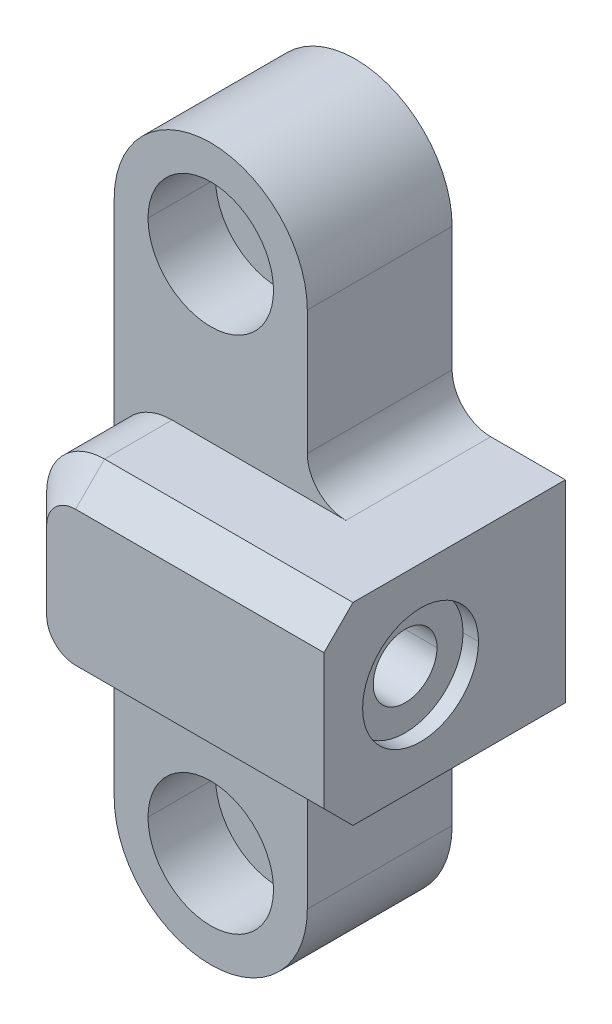
ISO-10303-21;
HEADER;
FILE_DESCRIPTION(('STEP AP214'),'2;1');
FILE_NAME('part.step','',(''),(''),'','','');
FILE_SCHEMA(('AUTOMOTIVE_DESIGN { 1 0 10303 214 1 1 1 1 }'));
ENDSEC;
DATA;
#1=APPLICATION_CONTEXT('core data for automotive mechanical design processes');
#2=APPLICATION_PROTOCOL_DEFINITION('international standard','automotive_design',2000,#1);
#3=PRODUCT_CONTEXT('',#1,'mechanical');
#4=PRODUCT('Part','Part','',(#3));
#5=PRODUCT_RELATED_PRODUCT_CATEGORY('part','',(#4));
#6=PRODUCT_DEFINITION_FORMATION('','',#4);
#7=PRODUCT_DEFINITION_CONTEXT('part definition',#1,'design');
#8=PRODUCT_DEFINITION('design','',#6,#7);
#9=PRODUCT_DEFINITION_SHAPE('','',#8);
#10=(LENGTH_UNIT() NAMED_UNIT(*) SI_UNIT(.MILLI.,.METRE.));
#11=(NAMED_UNIT(*) PLANE_ANGLE_UNIT() SI_UNIT($,.RADIAN.));
#12=(NAMED_UNIT(*) SI_UNIT($,.STERADIAN.) SOLID_ANGLE_UNIT());
#13=UNCERTAINTY_MEASURE_WITH_UNIT(LENGTH_MEASURE(1.E-05),#10,'distance_accuracy_value','');
#14=(GEOMETRIC_REPRESENTATION_CONTEXT(3) GLOBAL_UNCERTAINTY_ASSIGNED_CONTEXT((#13)) GLOBAL_UNIT_ASSIGNED_CONTEXT((#10,
#11,#12)) REPRESENTATION_CONTEXT('',''));
#15=CARTESIAN_POINT('',(0.,0.,0.));
#16=DIRECTION('',(0.,0.,1.));
#17=DIRECTION('',(1.,0.,0.));
#18=AXIS2_PLACEMENT_3D('',#15,#16,#17);
#19=CARTESIAN_POINT('',(-2.74531104495465,-3.5,12.5));
#20=DIRECTION('',(0.,-0.707106781186547,0.707106781186548));
#21=DIRECTION('',(-1.,0.,0.));
#22=AXIS2_PLACEMENT_3D('',#19,#20,#21);
#23=PLANE('',#22);
#24=DIRECTION('',(0.,-0.707106781186548,-0.707106781186547));
#25=VECTOR('',#24,1.);
#26=CARTESIAN_POINT('',(11.4350288425443,-3.5,12.5));
#27=LINE('',#26,#25);
#28=CARTESIAN_POINT('',(11.4350288425443,-3.5,12.5));
#29=VERTEX_POINT('',#28);
#30=CARTESIAN_POINT('',(11.4350288425443,-5.,11.));
#31=VERTEX_POINT('',#30);
#32=EDGE_CURVE('E9',#29,#31,#27,.T.);
#33=ORIENTED_EDGE('',*,*,#32,.T.);
#34=DIRECTION('',(-1.,0.,0.));
#35=VECTOR('',#34,1.);
#36=CARTESIAN_POINT('',(11.4350288425443,-5.,11.));
#37=LINE('',#36,#35);
#38=CARTESIAN_POINT('',(24.300000000001,-5.,11.));
#39=VERTEX_POINT('',#38);
#40=EDGE_CURVE('E492',#39,#31,#37,.T.);
#41=ORIENTED_EDGE('',*,*,#40,.F.);
#42=DIRECTION('',(0.,-0.707106781186548,-0.707106781186547));
#43=VECTOR('',#42,1.);
#44=CARTESIAN_POINT('',(24.300000000001,-3.5,12.5));
#45=LINE('',#44,#43);
#46=CARTESIAN_POINT('',(24.300000000001,-3.5,12.5));
#47=VERTEX_POINT('',#46);
#48=EDGE_CURVE('E453',#47,#39,#45,.T.);
#49=ORIENTED_EDGE('',*,*,#48,.F.);
#50=DIRECTION('',(1.,0.,0.));
#51=VECTOR('',#50,1.);
#52=CARTESIAN_POINT('',(24.300000000001,-3.5,12.5));
#53=LINE('',#52,#51);
#54=EDGE_CURVE('E483',#29,#47,#53,.T.);
#55=ORIENTED_EDGE('',*,*,#54,.F.);
#56=EDGE_LOOP('',(#33,#41,#49,#55));
#57=FACE_BOUND('',#56,.T.);
#58=ADVANCED_FACE('F15',(#57),#23,.T.);
#59=CARTESIAN_POINT('',(11.4350288425443,-2.,12.5));
#60=DIRECTION('',(0.,0.,-1.));
#61=DIRECTION('',(-1.,0.,0.));
#62=AXIS2_PLACEMENT_3D('',#59,#60,#61);
#63=CONICAL_SURFACE('',#62,1.5,0.785398163397449);
#64=DIRECTION('',(-0.707106781186549,0.,-0.707106781186546));
#65=VECTOR('',#64,1.);
#66=CARTESIAN_POINT('',(9.9350288425443,-2.,12.5));
#67=LINE('',#66,#65);
#68=CARTESIAN_POINT('',(9.9350288425443,-2.,12.5));
#69=VERTEX_POINT('',#68);
#70=CARTESIAN_POINT('',(8.4350288425443,-2.,11.));
#71=VERTEX_POINT('',#70);
#72=EDGE_CURVE('E23',#69,#71,#67,.T.);
#73=ORIENTED_EDGE('',*,*,#72,.T.);
#74=CARTESIAN_POINT('',(11.4350288425443,-2.,11.));
#75=DIRECTION('',(0.,0.,-1.));
#76=DIRECTION('',(1.,0.,0.));
#77=AXIS2_PLACEMENT_3D('',#74,#75,#76);
#78=CIRCLE('',#77,3.);
#79=EDGE_CURVE('E286',#31,#71,#78,.T.);
#80=ORIENTED_EDGE('',*,*,#79,.F.);
#81=ORIENTED_EDGE('',*,*,#32,.F.);
#82=CARTESIAN_POINT('',(11.4350288425443,-2.,12.5));
#83=DIRECTION('',(0.,0.,1.));
#84=DIRECTION('',(0.,-1.,0.));
#85=AXIS2_PLACEMENT_3D('',#82,#83,#84);
#86=CIRCLE('',#85,1.5);
#87=EDGE_CURVE('E587',#69,#29,#86,.T.);
#88=ORIENTED_EDGE('',*,*,#87,.F.);
#89=EDGE_LOOP('',(#73,#80,#81,#88));
#90=FACE_BOUND('',#89,.T.);
#91=ADVANCED_FACE('F618',(#90),#63,.T.);
#92=CARTESIAN_POINT('',(8.4350288425443,13.4350288425445,11.));
#93=DIRECTION('',(-0.707106781186547,0.,0.707106781186549));
#94=DIRECTION('',(0.,1.,0.));
#95=AXIS2_PLACEMENT_3D('',#92,#93,#94);
#96=PLANE('',#95);
#97=DIRECTION('',(-0.707106781186548,0.,-0.707106781186547));
#98=VECTOR('',#97,1.);
#99=CARTESIAN_POINT('',(9.9350288425443,2.,12.5));
#100=LINE('',#99,#98);
#101=CARTESIAN_POINT('',(9.9350288425443,2.,12.5));
#102=VERTEX_POINT('',#101);
#103=CARTESIAN_POINT('',(8.4350288425443,2.,11.));
#104=VERTEX_POINT('',#103);
#105=EDGE_CURVE('E36',#102,#104,#100,.T.);
#106=ORIENTED_EDGE('',*,*,#105,.T.);
#107=DIRECTION('',(0.,1.,0.));
#108=VECTOR('',#107,1.);
#109=CARTESIAN_POINT('',(8.4350288425443,2.,11.));
#110=LINE('',#109,#108);
#111=EDGE_CURVE('E474',#71,#104,#110,.T.);
#112=ORIENTED_EDGE('',*,*,#111,.F.);
#113=ORIENTED_EDGE('',*,*,#72,.F.);
#114=DIRECTION('',(0.,-1.,0.));
#115=VECTOR('',#114,1.);
#116=CARTESIAN_POINT('',(9.9350288425443,-2.,12.5));
#117=LINE('',#116,#115);
#118=EDGE_CURVE('E347',#102,#69,#117,.T.);
#119=ORIENTED_EDGE('',*,*,#118,.F.);
#120=EDGE_LOOP('',(#106,#112,#113,#119));
#121=FACE_BOUND('',#120,.T.);
#122=ADVANCED_FACE('F626',(#121),#96,.T.);
#123=CARTESIAN_POINT('',(11.4350288425443,2.,12.5));
#124=DIRECTION('',(0.,0.,-1.));
#125=DIRECTION('',(-1.,0.,0.));
#126=AXIS2_PLACEMENT_3D('',#123,#124,#125);
#127=CONICAL_SURFACE('',#126,1.5,0.785398163397449);
#128=DIRECTION('',(0.,0.707106781186549,-0.707106781186547));
#129=VECTOR('',#128,1.);
#130=CARTESIAN_POINT('',(11.4350288425443,3.5,12.5));
#131=LINE('',#130,#129);
#132=CARTESIAN_POINT('',(11.4350288425443,3.5,12.5));
#133=VERTEX_POINT('',#132);
#134=CARTESIAN_POINT('',(11.4350288425443,5.,11.));
#135=VERTEX_POINT('',#134);
#136=EDGE_CURVE('E47',#133,#135,#131,.T.);
#137=ORIENTED_EDGE('',*,*,#136,.T.);
#138=CARTESIAN_POINT('',(11.4350288425443,2.,11.));
#139=DIRECTION('',(0.,0.,-1.));
#140=DIRECTION('',(1.,0.,0.));
#141=AXIS2_PLACEMENT_3D('',#138,#139,#140);
#142=CIRCLE('',#141,3.);
#143=EDGE_CURVE('E570',#104,#135,#142,.T.);
#144=ORIENTED_EDGE('',*,*,#143,.F.);
#145=ORIENTED_EDGE('',*,*,#105,.F.);
#146=CARTESIAN_POINT('',(11.4350288425443,2.,12.5));
#147=DIRECTION('',(0.,0.,1.));
#148=DIRECTION('',(0.,-1.,0.));
#149=AXIS2_PLACEMENT_3D('',#146,#147,#148);
#150=CIRCLE('',#149,1.5);
#151=EDGE_CURVE('E352',#133,#102,#150,.T.);
#152=ORIENTED_EDGE('',*,*,#151,.F.);
#153=EDGE_LOOP('',(#137,#144,#145,#152));
#154=FACE_BOUND('',#153,.T.);
#155=ADVANCED_FACE('F645',(#154),#127,.T.);
#156=CARTESIAN_POINT('',(24.300000000001,5.,11.));
#157=DIRECTION('',(0.,0.707106781186547,0.707106781186548));
#158=DIRECTION('',(1.,0.,0.));
#159=AXIS2_PLACEMENT_3D('',#156,#157,#158);
#160=PLANE('',#159);
#161=DIRECTION('',(0.,-0.707106781186549,0.707106781186547));
#162=VECTOR('',#161,1.);
#163=CARTESIAN_POINT('',(24.300000000001,5.,11.));
#164=LINE('',#163,#162);
#165=CARTESIAN_POINT('',(24.300000000001,5.,11.));
#166=VERTEX_POINT('',#165);
#167=CARTESIAN_POINT('',(24.300000000001,3.5,12.5));
#168=VERTEX_POINT('',#167);
#169=EDGE_CURVE('E452',#166,#168,#164,.T.);
#170=ORIENTED_EDGE('',*,*,#169,.F.);
#171=DIRECTION('',(1.,0.,0.));
#172=VECTOR('',#171,1.);
#173=CARTESIAN_POINT('',(24.300000000001,5.,11.));
#174=LINE('',#173,#172);
#175=EDGE_CURVE('E433',#135,#166,#174,.T.);
#176=ORIENTED_EDGE('',*,*,#175,.F.);
#177=ORIENTED_EDGE('',*,*,#136,.F.);
#178=DIRECTION('',(-1.,0.,0.));
#179=VECTOR('',#178,1.);
#180=CARTESIAN_POINT('',(11.4350288425443,3.5,12.5));
#181=LINE('',#180,#179);
#182=EDGE_CURVE('E479',#168,#133,#181,.T.);
#183=ORIENTED_EDGE('',*,*,#182,.F.);
#184=EDGE_LOOP('',(#170,#176,#177,#183));
#185=FACE_BOUND('',#184,.T.);
#186=ADVANCED_FACE('F652',(#185),#160,.T.);
#187=CARTESIAN_POINT('',(11.4350288425443,2.,7.5));
#188=DIRECTION('',(0.,0.,-1.));
#189=DIRECTION('',(-1.,0.,0.));
#190=AXIS2_PLACEMENT_3D('',#187,#188,#189);
#191=CYLINDRICAL_SURFACE('',#190,3.);
#192=DIRECTION('',(0.,0.,-1.));
#193=VECTOR('',#192,1.);
#194=CARTESIAN_POINT('',(8.4350288425443,2.,7.5));
#195=LINE('',#194,#193);
#196=CARTESIAN_POINT('',(8.4350288425443,2.,7.5));
#197=VERTEX_POINT('',#196);
#198=EDGE_CURVE('E523',#104,#197,#195,.T.);
#199=ORIENTED_EDGE('',*,*,#198,.F.);
#200=ORIENTED_EDGE('',*,*,#143,.T.);
#201=DIRECTION('',(0.,0.,1.));
#202=VECTOR('',#201,1.);
#203=CARTESIAN_POINT('',(11.4350288425443,5.,7.5));
#204=LINE('',#203,#202);
#205=CARTESIAN_POINT('',(11.4350288425443,5.,7.5));
#206=VERTEX_POINT('',#205);
#207=EDGE_CURVE('E579',#206,#135,#204,.T.);
#208=ORIENTED_EDGE('',*,*,#207,.F.);
#209=CARTESIAN_POINT('',(11.4350288425443,2.,7.5));
#210=DIRECTION('',(0.,0.,-1.));
#211=DIRECTION('',(1.,0.,0.));
#212=AXIS2_PLACEMENT_3D('',#209,#210,#211);
#213=CIRCLE('',#212,3.);
#214=EDGE_CURVE('E413',#197,#206,#213,.T.);
#215=ORIENTED_EDGE('',*,*,#214,.F.);
#216=EDGE_LOOP('',(#199,#200,#208,#215));
#217=FACE_BOUND('',#216,.T.);
#218=ADVANCED_FACE('F648',(#217),#191,.T.);
#219=CARTESIAN_POINT('',(11.4350288425443,-2.,7.5));
#220=DIRECTION('',(0.,0.,1.));
#221=DIRECTION('',(1.,0.,0.));
#222=AXIS2_PLACEMENT_3D('',#219,#220,#221);
#223=CYLINDRICAL_SURFACE('',#222,3.);
#224=DIRECTION('',(0.,0.,-1.));
#225=VECTOR('',#224,1.);
#226=CARTESIAN_POINT('',(11.4350288425443,-5.,7.5));
#227=LINE('',#226,#225);
#228=CARTESIAN_POINT('',(11.4350288425443,-5.,7.5));
#229=VERTEX_POINT('',#228);
#230=EDGE_CURVE('E496',#31,#229,#227,.T.);
#231=ORIENTED_EDGE('',*,*,#230,.F.);
#232=ORIENTED_EDGE('',*,*,#79,.T.);
#233=DIRECTION('',(0.,0.,1.));
#234=VECTOR('',#233,1.);
#235=CARTESIAN_POINT('',(8.4350288425443,-2.,7.5));
#236=LINE('',#235,#234);
#237=CARTESIAN_POINT('',(8.4350288425443,-2.,7.5));
#238=VERTEX_POINT('',#237);
#239=EDGE_CURVE('E470',#238,#71,#236,.T.);
#240=ORIENTED_EDGE('',*,*,#239,.F.);
#241=CARTESIAN_POINT('',(11.4350288425443,-2.,7.5));
#242=DIRECTION('',(0.,0.,-1.));
#243=DIRECTION('',(1.,0.,0.));
#244=AXIS2_PLACEMENT_3D('',#241,#242,#243);
#245=CIRCLE('',#244,3.);
#246=EDGE_CURVE('E327',#229,#238,#245,.T.);
#247=ORIENTED_EDGE('',*,*,#246,.F.);
#248=EDGE_LOOP('',(#231,#232,#240,#247));
#249=FACE_BOUND('',#248,.T.);
#250=ADVANCED_FACE('F623',(#249),#223,.T.);
#251=CARTESIAN_POINT('',(23.500000000001,0.,7.5));
#252=DIRECTION('',(1.,0.,0.));
#253=DIRECTION('',(0.,0.,-1.));
#254=AXIS2_PLACEMENT_3D('',#251,#252,#253);
#255=CYLINDRICAL_SURFACE('',#254,1.65);
#256=DIRECTION('',(1.,0.,0.));
#257=VECTOR('',#256,1.);
#258=CARTESIAN_POINT('',(23.500000000001,0.,9.15));
#259=LINE('',#258,#257);
#260=CARTESIAN_POINT('',(14.500000000001,0.,9.15));
#261=VERTEX_POINT('',#260);
#262=CARTESIAN_POINT('',(23.500000000001,0.,9.15));
#263=VERTEX_POINT('',#262);
#264=EDGE_CURVE('E298',#261,#263,#259,.T.);
#265=ORIENTED_EDGE('',*,*,#264,.F.);
#266=CARTESIAN_POINT('',(14.500000000001,0.,7.5));
#267=DIRECTION('',(1.,0.,0.));
#268=DIRECTION('',(0.,0.,-1.));
#269=AXIS2_PLACEMENT_3D('',#266,#267,#268);
#270=CIRCLE('',#269,1.65);
#271=CARTESIAN_POINT('',(14.500000000001,0.,5.85));
#272=VERTEX_POINT('',#271);
#273=EDGE_CURVE('E275',#272,#261,#270,.T.);
#274=ORIENTED_EDGE('',*,*,#273,.F.);
#275=DIRECTION('',(1.,0.,0.));
#276=VECTOR('',#275,1.);
#277=CARTESIAN_POINT('',(23.500000000001,0.,5.85));
#278=LINE('',#277,#276);
#279=CARTESIAN_POINT('',(23.500000000001,0.,5.85));
#280=VERTEX_POINT('',#279);
#281=EDGE_CURVE('E307',#272,#280,#278,.T.);
#282=ORIENTED_EDGE('',*,*,#281,.T.);
#283=CARTESIAN_POINT('',(23.500000000001,0.,7.5));
#284=DIRECTION('',(1.,0.,0.));
#285=DIRECTION('',(0.,0.,-1.));
#286=AXIS2_PLACEMENT_3D('',#283,#284,#285);
#287=CIRCLE('',#286,1.65);
#288=EDGE_CURVE('E287',#280,#263,#287,.T.);
#289=ORIENTED_EDGE('',*,*,#288,.T.);
#290=EDGE_LOOP('',(#265,#274,#282,#289));
#291=FACE_BOUND('',#290,.T.);
#292=ADVANCED_FACE('F299',(#291),#255,.F.);
#293=CARTESIAN_POINT('',(14.500000000001,0.,7.5));
#294=DIRECTION('',(1.,0.,0.));
#295=DIRECTION('',(0.,0.,-1.));
#296=AXIS2_PLACEMENT_3D('',#293,#294,#295);
#297=CONICAL_SURFACE('',#296,1.65,1.02974425867665);
#298=DIRECTION('',(0.515038074910056,0.,0.857167300702112));
#299=VECTOR('',#298,1.);
#300=CARTESIAN_POINT('',(14.500000000001,0.,9.15));
#301=LINE('',#300,#299);
#302=CARTESIAN_POINT('',(13.5085799786055,0.,7.5));
#303=VERTEX_POINT('',#302);
#304=EDGE_CURVE('E278',#303,#261,#301,.T.);
#305=ORIENTED_EDGE('',*,*,#304,.F.);
#306=DIRECTION('',(0.515038074910056,0.,-0.857167300702112));
#307=VECTOR('',#306,1.);
#308=CARTESIAN_POINT('',(14.500000000001,0.,5.85));
#309=LINE('',#308,#307);
#310=EDGE_CURVE('E280',#303,#272,#309,.T.);
#311=ORIENTED_EDGE('',*,*,#310,.T.);
#312=ORIENTED_EDGE('',*,*,#273,.T.);
#313=EDGE_LOOP('',(#305,#311,#312));
#314=FACE_BOUND('',#313,.T.);
#315=ADVANCED_FACE('F277',(#314),#297,.F.);
#316=CARTESIAN_POINT('',(23.500000000001,0.,7.5));
#317=DIRECTION('',(1.,0.,0.));
#318=DIRECTION('',(0.,1.,0.));
#319=AXIS2_PLACEMENT_3D('',#316,#317,#318);
#320=PLANE('',#319);
#321=ORIENTED_EDGE('',*,*,#288,.F.);
#322=CARTESIAN_POINT('',(23.500000000001,0.,7.5));
#323=DIRECTION('',(1.,0.,0.));
#324=DIRECTION('',(0.,0.,-1.));
#325=AXIS2_PLACEMENT_3D('',#322,#323,#324);
#326=CIRCLE('',#325,1.65);
#327=EDGE_CURVE('E304',#263,#280,#326,.T.);
#328=ORIENTED_EDGE('',*,*,#327,.F.);
#329=EDGE_LOOP('',(#321,#328));
#330=FACE_BOUND('',#329,.T.);
#331=CARTESIAN_POINT('',(23.500000000001,0.,7.5));
#332=DIRECTION('',(1.,0.,0.));
#333=DIRECTION('',(0.,0.,-1.));
#334=AXIS2_PLACEMENT_3D('',#331,#332,#333);
#335=CIRCLE('',#334,3.);
#336=CARTESIAN_POINT('',(23.500000000001,0.,4.5));
#337=VERTEX_POINT('',#336);
#338=CARTESIAN_POINT('',(23.500000000001,0.,10.5));
#339=VERTEX_POINT('',#338);
#340=EDGE_CURVE('E351',#337,#339,#335,.T.);
#341=ORIENTED_EDGE('',*,*,#340,.T.);
#342=CARTESIAN_POINT('',(23.500000000001,0.,7.5));
#343=DIRECTION('',(1.,0.,0.));
#344=DIRECTION('',(0.,0.,-1.));
#345=AXIS2_PLACEMENT_3D('',#342,#343,#344);
#346=CIRCLE('',#345,3.);
#347=EDGE_CURVE('E295',#339,#337,#346,.T.);
#348=ORIENTED_EDGE('',*,*,#347,.T.);
#349=EDGE_LOOP('',(#341,#348));
#350=FACE_BOUND('',#349,.T.);
#351=ADVANCED_FACE('F727',(#330,#350),#320,.T.);
#352=CARTESIAN_POINT('',(23.500000000001,0.,7.5));
#353=DIRECTION('',(1.,0.,0.));
#354=DIRECTION('',(0.,0.,-1.));
#355=AXIS2_PLACEMENT_3D('',#352,#353,#354);
#356=CYLINDRICAL_SURFACE('',#355,3.);
#357=DIRECTION('',(1.,0.,0.));
#358=VECTOR('',#357,1.);
#359=CARTESIAN_POINT('',(23.500000000001,0.,10.5));
#360=LINE('',#359,#358);
#361=CARTESIAN_POINT('',(24.300000000001,0.,10.5));
#362=VERTEX_POINT('',#361);
#363=EDGE_CURVE('E313',#339,#362,#360,.T.);
#364=ORIENTED_EDGE('',*,*,#363,.F.);
#365=ORIENTED_EDGE('',*,*,#340,.F.);
#366=DIRECTION('',(1.,0.,0.));
#367=VECTOR('',#366,1.);
#368=CARTESIAN_POINT('',(23.500000000001,0.,4.5));
#369=LINE('',#368,#367);
#370=CARTESIAN_POINT('',(24.300000000001,0.,4.5));
#371=VERTEX_POINT('',#370);
#372=EDGE_CURVE('E321',#337,#371,#369,.T.);
#373=ORIENTED_EDGE('',*,*,#372,.T.);
#374=CARTESIAN_POINT('',(24.300000000001,0.,7.5));
#375=DIRECTION('',(1.,0.,0.));
#376=DIRECTION('',(0.,0.,-1.));
#377=AXIS2_PLACEMENT_3D('',#374,#375,#376);
#378=CIRCLE('',#377,3.);
#379=EDGE_CURVE('E576',#371,#362,#378,.T.);
#380=ORIENTED_EDGE('',*,*,#379,.T.);
#381=EDGE_LOOP('',(#364,#365,#373,#380));
#382=FACE_BOUND('',#381,.T.);
#383=ADVANCED_FACE('F730',(#382),#356,.F.);
#384=CARTESIAN_POINT('',(-2.74531104495465,-5.,12.5));
#385=DIRECTION('',(0.,0.,1.));
#386=DIRECTION('',(0.,-1.,0.));
#387=AXIS2_PLACEMENT_3D('',#384,#385,#386);
#388=PLANE('',#387);
#389=ORIENTED_EDGE('',*,*,#87,.T.);
#390=ORIENTED_EDGE('',*,*,#54,.T.);
#391=DIRECTION('',(0.,-1.,0.));
#392=VECTOR('',#391,1.);
#393=CARTESIAN_POINT('',(24.300000000001,-5.,12.5));
#394=LINE('',#393,#392);
#395=EDGE_CURVE('E532',#168,#47,#394,.T.);
#396=ORIENTED_EDGE('',*,*,#395,.F.);
#397=ORIENTED_EDGE('',*,*,#182,.T.);
#398=ORIENTED_EDGE('',*,*,#151,.T.);
#399=ORIENTED_EDGE('',*,*,#118,.T.);
#400=EDGE_LOOP('',(#389,#390,#396,#397,#398,#399));
#401=FACE_BOUND('',#400,.T.);
#402=ADVANCED_FACE('F644',(#401),#388,.T.);
#403=CARTESIAN_POINT('',(13.4350288425443,13.4350288425445,4.));
#404=DIRECTION('',(0.,0.,1.));
#405=DIRECTION('',(1.,0.,0.));
#406=AXIS2_PLACEMENT_3D('',#403,#404,#405);
#407=PLANE('',#406);
#408=CARTESIAN_POINT('',(13.4350288425443,13.4350288425445,4.));
#409=DIRECTION('',(0.,0.,1.));
#410=DIRECTION('',(1.,0.,0.));
#411=AXIS2_PLACEMENT_3D('',#408,#409,#410);
#412=CIRCLE('',#411,1.7);
#413=CARTESIAN_POINT('',(11.7350288425443,13.4350288425445,4.));
#414=VERTEX_POINT('',#413);
#415=CARTESIAN_POINT('',(15.1350288425443,13.4350288425445,4.));
#416=VERTEX_POINT('',#415);
#417=EDGE_CURVE('E430',#414,#416,#412,.T.);
#418=ORIENTED_EDGE('',*,*,#417,.F.);
#419=CARTESIAN_POINT('',(13.4350288425443,13.4350288425445,4.));
#420=DIRECTION('',(0.,0.,1.));
#421=DIRECTION('',(1.,0.,0.));
#422=AXIS2_PLACEMENT_3D('',#419,#420,#421);
#423=CIRCLE('',#422,1.7);
#424=EDGE_CURVE('E438',#416,#414,#423,.T.);
#425=ORIENTED_EDGE('',*,*,#424,.F.);
#426=EDGE_LOOP('',(#418,#425));
#427=FACE_BOUND('',#426,.T.);
#428=CARTESIAN_POINT('',(13.4350288425443,13.4350288425445,4.));
#429=DIRECTION('',(0.,0.,1.));
#430=DIRECTION('',(1.,0.,0.));
#431=AXIS2_PLACEMENT_3D('',#428,#429,#430);
#432=CIRCLE('',#431,3.25);
#433=CARTESIAN_POINT('',(16.6850288425443,13.4350288425445,4.));
#434=VERTEX_POINT('',#433);
#435=CARTESIAN_POINT('',(10.1850288425443,13.4350288425445,4.));
#436=VERTEX_POINT('',#435);
#437=EDGE_CURVE('E390',#434,#436,#432,.T.);
#438=ORIENTED_EDGE('',*,*,#437,.T.);
#439=CARTESIAN_POINT('',(13.4350288425443,13.4350288425445,4.));
#440=DIRECTION('',(0.,0.,1.));
#441=DIRECTION('',(1.,0.,0.));
#442=AXIS2_PLACEMENT_3D('',#439,#440,#441);
#443=CIRCLE('',#442,3.25);
#444=EDGE_CURVE('E371',#436,#434,#443,.T.);
#445=ORIENTED_EDGE('',*,*,#444,.T.);
#446=EDGE_LOOP('',(#438,#445));
#447=FACE_BOUND('',#446,.T.);
#448=ADVANCED_FACE('F1086',(#427,#447),#407,.T.);
#449=CARTESIAN_POINT('',(13.4350288425443,13.4350288425445,4.));
#450=DIRECTION('',(0.,0.,1.));
#451=DIRECTION('',(1.,0.,0.));
#452=AXIS2_PLACEMENT_3D('',#449,#450,#451);
#453=CYLINDRICAL_SURFACE('',#452,3.25);
#454=DIRECTION('',(0.,0.,1.));
#455=VECTOR('',#454,1.);
#456=CARTESIAN_POINT('',(10.1850288425443,13.4350288425445,4.));
#457=LINE('',#456,#455);
#458=CARTESIAN_POINT('',(10.1850288425443,13.4350288425445,7.5));
#459=VERTEX_POINT('',#458);
#460=EDGE_CURVE('E366',#436,#459,#457,.T.);
#461=ORIENTED_EDGE('',*,*,#460,.F.);
#462=ORIENTED_EDGE('',*,*,#437,.F.);
#463=DIRECTION('',(0.,0.,1.));
#464=VECTOR('',#463,1.);
#465=CARTESIAN_POINT('',(16.6850288425443,13.4350288425445,4.));
#466=LINE('',#465,#464);
#467=CARTESIAN_POINT('',(16.6850288425443,13.4350288425445,7.5));
#468=VERTEX_POINT('',#467);
#469=EDGE_CURVE('E386',#434,#468,#466,.T.);
#470=ORIENTED_EDGE('',*,*,#469,.T.);
#471=CARTESIAN_POINT('',(13.4350288425443,13.4350288425445,7.5));
#472=DIRECTION('',(0.,0.,1.));
#473=DIRECTION('',(1.,0.,0.));
#474=AXIS2_PLACEMENT_3D('',#471,#472,#473);
#475=CIRCLE('',#474,3.25);
#476=EDGE_CURVE('E442',#468,#459,#475,.T.);
#477=ORIENTED_EDGE('',*,*,#476,.T.);
#478=EDGE_LOOP('',(#461,#462,#470,#477));
#479=FACE_BOUND('',#478,.T.);
#480=ADVANCED_FACE('F1096',(#479),#453,.F.);
#481=CARTESIAN_POINT('',(13.4350288425445,-13.4350288425443,4.));
#482=DIRECTION('',(0.,0.,1.));
#483=DIRECTION('',(1.,0.,0.));
#484=AXIS2_PLACEMENT_3D('',#481,#482,#483);
#485=PLANE('',#484);
#486=CARTESIAN_POINT('',(13.4350288425445,-13.4350288425443,4.));
#487=DIRECTION('',(0.,0.,1.));
#488=DIRECTION('',(1.,0.,0.));
#489=AXIS2_PLACEMENT_3D('',#486,#487,#488);
#490=CIRCLE('',#489,1.7);
#491=CARTESIAN_POINT('',(11.7350288425445,-13.4350288425443,4.));
#492=VERTEX_POINT('',#491);
#493=CARTESIAN_POINT('',(15.1350288425445,-13.4350288425443,4.));
#494=VERTEX_POINT('',#493);
#495=EDGE_CURVE('E399',#492,#494,#490,.T.);
#496=ORIENTED_EDGE('',*,*,#495,.F.);
#497=CARTESIAN_POINT('',(13.4350288425445,-13.4350288425443,4.));
#498=DIRECTION('',(0.,0.,1.));
#499=DIRECTION('',(1.,0.,0.));
#500=AXIS2_PLACEMENT_3D('',#497,#498,#499);
#501=CIRCLE('',#500,1.7);
#502=EDGE_CURVE('E484',#494,#492,#501,.T.);
#503=ORIENTED_EDGE('',*,*,#502,.F.);
#504=EDGE_LOOP('',(#496,#503));
#505=FACE_BOUND('',#504,.T.);
#506=CARTESIAN_POINT('',(13.4350288425445,-13.4350288425443,4.));
#507=DIRECTION('',(0.,0.,1.));
#508=DIRECTION('',(1.,0.,0.));
#509=AXIS2_PLACEMENT_3D('',#506,#507,#508);
#510=CIRCLE('',#509,3.25);
#511=CARTESIAN_POINT('',(16.6850288425445,-13.4350288425443,4.));
#512=VERTEX_POINT('',#511);
#513=CARTESIAN_POINT('',(10.1850288425445,-13.4350288425443,4.));
#514=VERTEX_POINT('',#513);
#515=EDGE_CURVE('E387',#512,#514,#510,.T.);
#516=ORIENTED_EDGE('',*,*,#515,.T.);
#517=CARTESIAN_POINT('',(13.4350288425445,-13.4350288425443,4.));
#518=DIRECTION('',(0.,0.,1.));
#519=DIRECTION('',(1.,0.,0.));
#520=AXIS2_PLACEMENT_3D('',#517,#518,#519);
#521=CIRCLE('',#520,3.25);
#522=EDGE_CURVE('E360',#514,#512,#521,.T.);
#523=ORIENTED_EDGE('',*,*,#522,.T.);
#524=EDGE_LOOP('',(#516,#523));
#525=FACE_BOUND('',#524,.T.);
#526=ADVANCED_FACE('F1107',(#505,#525),#485,.T.);
#527=CARTESIAN_POINT('',(13.4350288425445,-13.4350288425443,4.));
#528=DIRECTION('',(0.,0.,1.));
#529=DIRECTION('',(1.,0.,0.));
#530=AXIS2_PLACEMENT_3D('',#527,#528,#529);
#531=CYLINDRICAL_SURFACE('',#530,3.25);
#532=DIRECTION('',(0.,0.,1.));
#533=VECTOR('',#532,1.);
#534=CARTESIAN_POINT('',(10.1850288425445,-13.4350288425443,4.));
#535=LINE('',#534,#533);
#536=CARTESIAN_POINT('',(10.1850288425445,-13.4350288425443,7.5));
#537=VERTEX_POINT('',#536);
#538=EDGE_CURVE('E355',#514,#537,#535,.T.);
#539=ORIENTED_EDGE('',*,*,#538,.F.);
#540=ORIENTED_EDGE('',*,*,#515,.F.);
#541=DIRECTION('',(0.,0.,1.));
#542=VECTOR('',#541,1.);
#543=CARTESIAN_POINT('',(16.6850288425445,-13.4350288425443,4.));
#544=LINE('',#543,#542);
#545=CARTESIAN_POINT('',(16.6850288425445,-13.4350288425443,7.5));
#546=VERTEX_POINT('',#545);
#547=EDGE_CURVE('E395',#512,#546,#544,.T.);
#548=ORIENTED_EDGE('',*,*,#547,.T.);
#549=CARTESIAN_POINT('',(13.4350288425445,-13.4350288425443,7.5));
#550=DIRECTION('',(0.,0.,1.));
#551=DIRECTION('',(1.,0.,0.));
#552=AXIS2_PLACEMENT_3D('',#549,#550,#551);
#553=CIRCLE('',#552,3.25);
#554=EDGE_CURVE('E506',#546,#537,#553,.T.);
#555=ORIENTED_EDGE('',*,*,#554,.T.);
#556=EDGE_LOOP('',(#539,#540,#548,#555));
#557=FACE_BOUND('',#556,.T.);
#558=ADVANCED_FACE('F1118',(#557),#531,.F.);
#559=CARTESIAN_POINT('',(20.4350288425443,7.,7.5));
#560=DIRECTION('',(0.,0.,1.));
#561=DIRECTION('',(1.,0.,0.));
#562=AXIS2_PLACEMENT_3D('',#559,#560,#561);
#563=CYLINDRICAL_SURFACE('',#562,2.);
#564=CARTESIAN_POINT('',(20.4350288425443,7.,7.5));
#565=DIRECTION('',(0.,0.,-1.));
#566=DIRECTION('',(1.,0.,0.));
#567=AXIS2_PLACEMENT_3D('',#564,#565,#566);
#568=CIRCLE('',#567,2.);
#569=CARTESIAN_POINT('',(20.4350288425443,5.,7.5));
#570=VERTEX_POINT('',#569);
#571=CARTESIAN_POINT('',(18.4350288425443,7.,7.5));
#572=VERTEX_POINT('',#571);
#573=EDGE_CURVE('E461',#570,#572,#568,.T.);
#574=ORIENTED_EDGE('',*,*,#573,.F.);
#575=DIRECTION('',(0.,0.,1.));
#576=VECTOR('',#575,1.);
#577=CARTESIAN_POINT('',(20.4350288425443,5.,7.5));
#578=LINE('',#577,#576);
#579=CARTESIAN_POINT('',(20.4350288425443,5.,0.));
#580=VERTEX_POINT('',#579);
#581=EDGE_CURVE('E422',#580,#570,#578,.T.);
#582=ORIENTED_EDGE('',*,*,#581,.F.);
#583=CARTESIAN_POINT('',(20.4350288425443,7.,0.));
#584=DIRECTION('',(0.,0.,1.));
#585=DIRECTION('',(1.,0.,0.));
#586=AXIS2_PLACEMENT_3D('',#583,#584,#585);
#587=CIRCLE('',#586,2.);
#588=CARTESIAN_POINT('',(18.4350288425443,7.,0.));
#589=VERTEX_POINT('',#588);
#590=EDGE_CURVE('E331',#589,#580,#587,.T.);
#591=ORIENTED_EDGE('',*,*,#590,.F.);
#592=DIRECTION('',(0.,0.,-1.));
#593=VECTOR('',#592,1.);
#594=CARTESIAN_POINT('',(18.4350288425443,7.,0.));
#595=LINE('',#594,#593);
#596=EDGE_CURVE('E418',#572,#589,#595,.T.);
#597=ORIENTED_EDGE('',*,*,#596,.F.);
#598=EDGE_LOOP('',(#574,#582,#591,#597));
#599=FACE_BOUND('',#598,.T.);
#600=ADVANCED_FACE('F684',(#599),#563,.F.);
#601=CARTESIAN_POINT('',(20.4350288425443,-7.,7.5));
#602=DIRECTION('',(0.,0.,1.));
#603=DIRECTION('',(1.,0.,0.));
#604=AXIS2_PLACEMENT_3D('',#601,#602,#603);
#605=CYLINDRICAL_SURFACE('',#604,2.);
#606=CARTESIAN_POINT('',(20.4350288425443,-7.,7.5));
#607=DIRECTION('',(0.,0.,-1.));
#608=DIRECTION('',(1.,0.,0.));
#609=AXIS2_PLACEMENT_3D('',#606,#607,#608);
#610=CIRCLE('',#609,2.);
#611=CARTESIAN_POINT('',(18.4350288425443,-7.,7.5));
#612=VERTEX_POINT('',#611);
#613=CARTESIAN_POINT('',(20.4350288425443,-5.,7.5));
#614=VERTEX_POINT('',#613);
#615=EDGE_CURVE('E364',#612,#614,#610,.T.);
#616=ORIENTED_EDGE('',*,*,#615,.F.);
#617=DIRECTION('',(0.,0.,1.));
#618=VECTOR('',#617,1.);
#619=CARTESIAN_POINT('',(18.4350288425443,-7.,7.5));
#620=LINE('',#619,#618);
#621=CARTESIAN_POINT('',(18.4350288425443,-7.,0.));
#622=VERTEX_POINT('',#621);
#623=EDGE_CURVE('E391',#622,#612,#620,.T.);
#624=ORIENTED_EDGE('',*,*,#623,.F.);
#625=CARTESIAN_POINT('',(20.4350288425443,-7.,0.));
#626=DIRECTION('',(0.,0.,1.));
#627=DIRECTION('',(1.,0.,0.));
#628=AXIS2_PLACEMENT_3D('',#625,#626,#627);
#629=CIRCLE('',#628,2.);
#630=CARTESIAN_POINT('',(20.4350288425443,-5.,0.));
#631=VERTEX_POINT('',#630);
#632=EDGE_CURVE('E505',#631,#622,#629,.T.);
#633=ORIENTED_EDGE('',*,*,#632,.F.);
#634=DIRECTION('',(0.,0.,-1.));
#635=VECTOR('',#634,1.);
#636=CARTESIAN_POINT('',(20.4350288425443,-5.,0.));
#637=LINE('',#636,#635);
#638=EDGE_CURVE('E536',#614,#631,#637,.T.);
#639=ORIENTED_EDGE('',*,*,#638,.F.);
#640=EDGE_LOOP('',(#616,#624,#633,#639));
#641=FACE_BOUND('',#640,.T.);
#642=ADVANCED_FACE('F677',(#641),#605,.F.);
#643=CARTESIAN_POINT('',(18.4350288425443,-5.,7.5));
#644=DIRECTION('',(-1.,0.,0.));
#645=DIRECTION('',(0.,0.,1.));
#646=AXIS2_PLACEMENT_3D('',#643,#644,#645);
#647=PLANE('',#646);
#648=DIRECTION('',(0.,1.,0.));
#649=VECTOR('',#648,1.);
#650=CARTESIAN_POINT('',(18.4350288425443,-5.,0.));
#651=LINE('',#650,#649);
#652=CARTESIAN_POINT('',(18.4350288425445,-13.4350288425443,0.));
#653=VERTEX_POINT('',#652);
#654=EDGE_CURVE('E542',#653,#622,#651,.T.);
#655=ORIENTED_EDGE('',*,*,#654,.T.);
#656=ORIENTED_EDGE('',*,*,#623,.T.);
#657=DIRECTION('',(0.,1.,0.));
#658=VECTOR('',#657,1.);
#659=CARTESIAN_POINT('',(18.4350288425443,-5.,7.5));
#660=LINE('',#659,#658);
#661=CARTESIAN_POINT('',(18.4350288425445,-13.4350288425443,7.5));
#662=VERTEX_POINT('',#661);
#663=EDGE_CURVE('E361',#662,#612,#660,.T.);
#664=ORIENTED_EDGE('',*,*,#663,.F.);
#665=DIRECTION('',(0.,0.,-1.));
#666=VECTOR('',#665,1.);
#667=CARTESIAN_POINT('',(18.4350288425445,-13.4350288425443,7.5));
#668=LINE('',#667,#666);
#669=EDGE_CURVE('E522',#662,#653,#668,.T.);
#670=ORIENTED_EDGE('',*,*,#669,.T.);
#671=EDGE_LOOP('',(#655,#656,#664,#670));
#672=FACE_BOUND('',#671,.T.);
#673=ADVANCED_FACE('F675',(#672),#647,.F.);
#674=CARTESIAN_POINT('',(13.4350288425445,-13.4350288425443,7.5));
#675=DIRECTION('',(0.,0.,-1.));
#676=DIRECTION('',(-1.,0.,0.));
#677=AXIS2_PLACEMENT_3D('',#674,#675,#676);
#678=CYLINDRICAL_SURFACE('',#677,5.);
#679=CARTESIAN_POINT('',(13.4350288425445,-13.4350288425443,0.));
#680=DIRECTION('',(0.,0.,1.));
#681=DIRECTION('',(1.,0.,0.));
#682=AXIS2_PLACEMENT_3D('',#679,#680,#681);
#683=CIRCLE('',#682,5.);
#684=CARTESIAN_POINT('',(8.4350288425443,-13.4350288425443,0.));
#685=VERTEX_POINT('',#684);
#686=EDGE_CURVE('E549',#685,#653,#683,.T.);
#687=ORIENTED_EDGE('',*,*,#686,.T.);
#688=ORIENTED_EDGE('',*,*,#669,.F.);
#689=CARTESIAN_POINT('',(13.4350288425445,-13.4350288425443,7.5));
#690=DIRECTION('',(0.,0.,1.));
#691=DIRECTION('',(1.,0.,0.));
#692=AXIS2_PLACEMENT_3D('',#689,#690,#691);
#693=CIRCLE('',#692,5.);
#694=CARTESIAN_POINT('',(8.4350288425443,-13.4350288425443,7.5));
#695=VERTEX_POINT('',#694);
#696=EDGE_CURVE('E326',#695,#662,#693,.T.);
#697=ORIENTED_EDGE('',*,*,#696,.F.);
#698=DIRECTION('',(0.,0.,-1.));
#699=VECTOR('',#698,1.);
#700=CARTESIAN_POINT('',(8.4350288425443,-13.4350288425443,7.5));
#701=LINE('',#700,#699);
#702=EDGE_CURVE('E519',#695,#685,#701,.T.);
#703=ORIENTED_EDGE('',*,*,#702,.T.);
#704=EDGE_LOOP('',(#687,#688,#697,#703));
#705=FACE_BOUND('',#704,.T.);
#706=ADVANCED_FACE('F672',(#705),#678,.T.);
#707=CARTESIAN_POINT('',(8.4350288425443,13.4350288425445,7.5));
#708=DIRECTION('',(1.,0.,0.));
#709=DIRECTION('',(0.,1.,0.));
#710=AXIS2_PLACEMENT_3D('',#707,#708,#709);
#711=PLANE('',#710);
#712=ORIENTED_EDGE('',*,*,#239,.T.);
#713=ORIENTED_EDGE('',*,*,#111,.T.);
#714=ORIENTED_EDGE('',*,*,#198,.T.);
#715=DIRECTION('',(0.,-1.,0.));
#716=VECTOR('',#715,1.);
#717=CARTESIAN_POINT('',(8.4350288425443,13.4350288425445,7.5));
#718=LINE('',#717,#716);
#719=CARTESIAN_POINT('',(8.4350288425443,13.4350288425445,7.5));
#720=VERTEX_POINT('',#719);
#721=EDGE_CURVE('E343',#720,#197,#718,.T.);
#722=ORIENTED_EDGE('',*,*,#721,.F.);
#723=DIRECTION('',(0.,0.,-1.));
#724=VECTOR('',#723,1.);
#725=CARTESIAN_POINT('',(8.4350288425443,13.4350288425445,7.5));
#726=LINE('',#725,#724);
#727=CARTESIAN_POINT('',(8.4350288425443,13.4350288425445,0.));
#728=VERTEX_POINT('',#727);
#729=EDGE_CURVE('E475',#720,#728,#726,.T.);
#730=ORIENTED_EDGE('',*,*,#729,.T.);
#731=DIRECTION('',(0.,-1.,0.));
#732=VECTOR('',#731,1.);
#733=CARTESIAN_POINT('',(8.4350288425443,13.4350288425445,0.));
#734=LINE('',#733,#732);
#735=EDGE_CURVE('E379',#728,#685,#734,.T.);
#736=ORIENTED_EDGE('',*,*,#735,.T.);
#737=ORIENTED_EDGE('',*,*,#702,.F.);
#738=DIRECTION('',(0.,-1.,0.));
#739=VECTOR('',#738,1.);
#740=CARTESIAN_POINT('',(8.4350288425443,13.4350288425445,7.5));
#741=LINE('',#740,#739);
#742=EDGE_CURVE('E322',#238,#695,#741,.T.);
#743=ORIENTED_EDGE('',*,*,#742,.F.);
#744=EDGE_LOOP('',(#712,#713,#714,#722,#730,#736,#737,#743));
#745=FACE_BOUND('',#744,.T.);
#746=ADVANCED_FACE('F628',(#745),#711,.F.);
#747=CARTESIAN_POINT('',(13.4350288425443,13.4350288425445,7.5));
#748=DIRECTION('',(0.,0.,-1.));
#749=DIRECTION('',(-1.,0.,0.));
#750=AXIS2_PLACEMENT_3D('',#747,#748,#749);
#751=CYLINDRICAL_SURFACE('',#750,5.);
#752=CARTESIAN_POINT('',(13.4350288425443,13.4350288425445,0.));
#753=DIRECTION('',(0.,0.,1.));
#754=DIRECTION('',(1.,0.,0.));
#755=AXIS2_PLACEMENT_3D('',#752,#753,#754);
#756=CIRCLE('',#755,5.);
#757=CARTESIAN_POINT('',(18.4350288425443,13.4350288425445,0.));
#758=VERTEX_POINT('',#757);
#759=EDGE_CURVE('E375',#758,#728,#756,.T.);
#760=ORIENTED_EDGE('',*,*,#759,.T.);
#761=ORIENTED_EDGE('',*,*,#729,.F.);
#762=CARTESIAN_POINT('',(13.4350288425443,13.4350288425445,7.5));
#763=DIRECTION('',(0.,0.,1.));
#764=DIRECTION('',(1.,0.,0.));
#765=AXIS2_PLACEMENT_3D('',#762,#763,#764);
#766=CIRCLE('',#765,5.);
#767=CARTESIAN_POINT('',(18.4350288425443,13.4350288425445,7.5));
#768=VERTEX_POINT('',#767);
#769=EDGE_CURVE('E469',#768,#720,#766,.T.);
#770=ORIENTED_EDGE('',*,*,#769,.F.);
#771=DIRECTION('',(0.,0.,-1.));
#772=VECTOR('',#771,1.);
#773=CARTESIAN_POINT('',(18.4350288425443,13.4350288425445,7.5));
#774=LINE('',#773,#772);
#775=EDGE_CURVE('E421',#768,#758,#774,.T.);
#776=ORIENTED_EDGE('',*,*,#775,.T.);
#777=EDGE_LOOP('',(#760,#761,#770,#776));
#778=FACE_BOUND('',#777,.T.);
#779=ADVANCED_FACE('F665',(#778),#751,.T.);
#780=CARTESIAN_POINT('',(18.4350288425443,13.4350288425445,7.5));
#781=DIRECTION('',(-1.,0.,0.));
#782=DIRECTION('',(0.,0.,1.));
#783=AXIS2_PLACEMENT_3D('',#780,#781,#782);
#784=PLANE('',#783);
#785=DIRECTION('',(0.,1.,0.));
#786=VECTOR('',#785,1.);
#787=CARTESIAN_POINT('',(18.4350288425443,13.4350288425445,7.5));
#788=LINE('',#787,#786);
#789=EDGE_CURVE('E465',#572,#768,#788,.T.);
#790=ORIENTED_EDGE('',*,*,#789,.F.);
#791=ORIENTED_EDGE('',*,*,#596,.T.);
#792=DIRECTION('',(0.,1.,0.));
#793=VECTOR('',#792,1.);
#794=CARTESIAN_POINT('',(18.4350288425443,13.4350288425445,0.));
#795=LINE('',#794,#793);
#796=EDGE_CURVE('E336',#589,#758,#795,.T.);
#797=ORIENTED_EDGE('',*,*,#796,.T.);
#798=ORIENTED_EDGE('',*,*,#775,.F.);
#799=EDGE_LOOP('',(#790,#791,#797,#798));
#800=FACE_BOUND('',#799,.T.);
#801=ADVANCED_FACE('F687',(#800),#784,.F.);
#802=CARTESIAN_POINT('',(24.300000000001,5.,7.5));
#803=DIRECTION('',(0.,-1.,0.));
#804=DIRECTION('',(0.,0.,-1.));
#805=AXIS2_PLACEMENT_3D('',#802,#803,#804);
#806=PLANE('',#805);
#807=ORIENTED_EDGE('',*,*,#207,.T.);
#808=ORIENTED_EDGE('',*,*,#175,.T.);
#809=DIRECTION('',(0.,0.,-1.));
#810=VECTOR('',#809,1.);
#811=CARTESIAN_POINT('',(24.300000000001,5.,7.5));
#812=LINE('',#811,#810);
#813=CARTESIAN_POINT('',(24.300000000001,5.,0.));
#814=VERTEX_POINT('',#813);
#815=EDGE_CURVE('E449',#166,#814,#812,.T.);
#816=ORIENTED_EDGE('',*,*,#815,.T.);
#817=DIRECTION('',(-1.,0.,0.));
#818=VECTOR('',#817,1.);
#819=CARTESIAN_POINT('',(24.300000000001,5.,0.));
#820=LINE('',#819,#818);
#821=EDGE_CURVE('E335',#814,#580,#820,.T.);
#822=ORIENTED_EDGE('',*,*,#821,.T.);
#823=ORIENTED_EDGE('',*,*,#581,.T.);
#824=DIRECTION('',(1.,0.,0.));
#825=VECTOR('',#824,1.);
#826=CARTESIAN_POINT('',(-2.74531104495465,5.,7.5));
#827=LINE('',#826,#825);
#828=EDGE_CURVE('E457',#206,#570,#827,.T.);
#829=ORIENTED_EDGE('',*,*,#828,.F.);
#830=EDGE_LOOP('',(#807,#808,#816,#822,#823,#829));
#831=FACE_BOUND('',#830,.T.);
#832=ADVANCED_FACE('F655',(#831),#806,.F.);
#833=CARTESIAN_POINT('',(24.300000000001,5.,7.5));
#834=DIRECTION('',(-1.,0.,0.));
#835=DIRECTION('',(0.,0.,1.));
#836=AXIS2_PLACEMENT_3D('',#833,#834,#835);
#837=PLANE('',#836);
#838=ORIENTED_EDGE('',*,*,#379,.F.);
#839=CARTESIAN_POINT('',(24.300000000001,0.,7.5));
#840=DIRECTION('',(1.,0.,0.));
#841=DIRECTION('',(0.,0.,-1.));
#842=AXIS2_PLACEMENT_3D('',#839,#840,#841);
#843=CIRCLE('',#842,3.);
#844=EDGE_CURVE('E317',#362,#371,#843,.T.);
#845=ORIENTED_EDGE('',*,*,#844,.F.);
#846=EDGE_LOOP('',(#838,#845));
#847=FACE_BOUND('',#846,.T.);
#848=ORIENTED_EDGE('',*,*,#395,.T.);
#849=ORIENTED_EDGE('',*,*,#48,.T.);
#850=DIRECTION('',(0.,0.,-1.));
#851=VECTOR('',#850,1.);
#852=CARTESIAN_POINT('',(24.300000000001,-5.,7.5));
#853=LINE('',#852,#851);
#854=CARTESIAN_POINT('',(24.300000000001,-5.,0.));
#855=VERTEX_POINT('',#854);
#856=EDGE_CURVE('E497',#39,#855,#853,.T.);
#857=ORIENTED_EDGE('',*,*,#856,.T.);
#858=DIRECTION('',(0.,1.,0.));
#859=VECTOR('',#858,1.);
#860=CARTESIAN_POINT('',(24.300000000001,5.,0.));
#861=LINE('',#860,#859);
#862=EDGE_CURVE('E559',#855,#814,#861,.T.);
#863=ORIENTED_EDGE('',*,*,#862,.T.);
#864=ORIENTED_EDGE('',*,*,#815,.F.);
#865=ORIENTED_EDGE('',*,*,#169,.T.);
#866=EDGE_LOOP('',(#848,#849,#857,#863,#864,#865));
#867=FACE_BOUND('',#866,.T.);
#868=ADVANCED_FACE('F681',(#847,#867),#837,.F.);
#869=CARTESIAN_POINT('',(24.300000000001,-5.,7.5));
#870=DIRECTION('',(0.,1.,0.));
#871=DIRECTION('',(1.,0.,0.));
#872=AXIS2_PLACEMENT_3D('',#869,#870,#871);
#873=PLANE('',#872);
#874=ORIENTED_EDGE('',*,*,#856,.F.);
#875=ORIENTED_EDGE('',*,*,#40,.T.);
#876=ORIENTED_EDGE('',*,*,#230,.T.);
#877=DIRECTION('',(1.,0.,0.));
#878=VECTOR('',#877,1.);
#879=CARTESIAN_POINT('',(-2.74531104495465,-5.,7.5));
#880=LINE('',#879,#878);
#881=EDGE_CURVE('E500',#229,#614,#880,.T.);
#882=ORIENTED_EDGE('',*,*,#881,.T.);
#883=ORIENTED_EDGE('',*,*,#638,.T.);
#884=DIRECTION('',(1.,0.,0.));
#885=VECTOR('',#884,1.);
#886=CARTESIAN_POINT('',(24.300000000001,-5.,0.));
#887=LINE('',#886,#885);
#888=EDGE_CURVE('E501',#631,#855,#887,.T.);
#889=ORIENTED_EDGE('',*,*,#888,.T.);
#890=EDGE_LOOP('',(#874,#875,#876,#882,#883,#889));
#891=FACE_BOUND('',#890,.T.);
#892=ADVANCED_FACE('F636',(#891),#873,.F.);
#893=CARTESIAN_POINT('',(13.4350288425445,-13.4350288425443,0.));
#894=DIRECTION('',(0.,0.,1.));
#895=DIRECTION('',(1.,0.,0.));
#896=AXIS2_PLACEMENT_3D('',#893,#894,#895);
#897=PLANE('',#896);
#898=CARTESIAN_POINT('',(13.4350288425445,-13.4350288425443,0.));
#899=DIRECTION('',(0.,0.,1.));
#900=DIRECTION('',(1.,0.,0.));
#901=AXIS2_PLACEMENT_3D('',#898,#899,#900);
#902=CIRCLE('',#901,1.7);
#903=CARTESIAN_POINT('',(11.7350288425445,-13.4350288425443,0.));
#904=VERTEX_POINT('',#903);
#905=CARTESIAN_POINT('',(15.1350288425445,-13.4350288425443,0.));
#906=VERTEX_POINT('',#905);
#907=EDGE_CURVE('E417',#904,#906,#902,.T.);
#908=ORIENTED_EDGE('',*,*,#907,.T.);
#909=CARTESIAN_POINT('',(13.4350288425445,-13.4350288425443,0.));
#910=DIRECTION('',(0.,0.,1.));
#911=DIRECTION('',(1.,0.,0.));
#912=AXIS2_PLACEMENT_3D('',#909,#910,#911);
#913=CIRCLE('',#912,1.7);
#914=EDGE_CURVE('E487',#906,#904,#913,.T.);
#915=ORIENTED_EDGE('',*,*,#914,.T.);
#916=EDGE_LOOP('',(#908,#915));
#917=FACE_BOUND('',#916,.T.);
#918=CARTESIAN_POINT('',(13.4350288425443,13.4350288425445,0.));
#919=DIRECTION('',(0.,0.,1.));
#920=DIRECTION('',(1.,0.,0.));
#921=AXIS2_PLACEMENT_3D('',#918,#919,#920);
#922=CIRCLE('',#921,1.7);
#923=CARTESIAN_POINT('',(11.7350288425443,13.4350288425445,0.));
#924=VERTEX_POINT('',#923);
#925=CARTESIAN_POINT('',(15.1350288425443,13.4350288425445,0.));
#926=VERTEX_POINT('',#925);
#927=EDGE_CURVE('E344',#924,#926,#922,.T.);
#928=ORIENTED_EDGE('',*,*,#927,.T.);
#929=CARTESIAN_POINT('',(13.4350288425443,13.4350288425445,0.));
#930=DIRECTION('',(0.,0.,1.));
#931=DIRECTION('',(1.,0.,0.));
#932=AXIS2_PLACEMENT_3D('',#929,#930,#931);
#933=CIRCLE('',#932,1.7);
#934=EDGE_CURVE('E441',#926,#924,#933,.T.);
#935=ORIENTED_EDGE('',*,*,#934,.T.);
#936=EDGE_LOOP('',(#928,#935));
#937=FACE_BOUND('',#936,.T.);
#938=ORIENTED_EDGE('',*,*,#888,.F.);
#939=ORIENTED_EDGE('',*,*,#632,.T.);
#940=ORIENTED_EDGE('',*,*,#654,.F.);
#941=ORIENTED_EDGE('',*,*,#686,.F.);
#942=ORIENTED_EDGE('',*,*,#735,.F.);
#943=ORIENTED_EDGE('',*,*,#759,.F.);
#944=ORIENTED_EDGE('',*,*,#796,.F.);
#945=ORIENTED_EDGE('',*,*,#590,.T.);
#946=ORIENTED_EDGE('',*,*,#821,.F.);
#947=ORIENTED_EDGE('',*,*,#862,.F.);
#948=EDGE_LOOP('',(#938,#939,#940,#941,#942,#943,#944,#945,#946,#947));
#949=FACE_BOUND('',#948,.T.);
#950=ADVANCED_FACE('F669',(#917,#937,#949),#897,.F.);
#951=CARTESIAN_POINT('',(13.4350288425445,-13.4350288425443,7.5));
#952=DIRECTION('',(0.,0.,1.));
#953=DIRECTION('',(1.,0.,0.));
#954=AXIS2_PLACEMENT_3D('',#951,#952,#953);
#955=PLANE('',#954);
#956=ORIENTED_EDGE('',*,*,#554,.F.);
#957=CARTESIAN_POINT('',(13.4350288425445,-13.4350288425443,7.5));
#958=DIRECTION('',(0.,0.,1.));
#959=DIRECTION('',(1.,0.,0.));
#960=AXIS2_PLACEMENT_3D('',#957,#958,#959);
#961=CIRCLE('',#960,3.25);
#962=EDGE_CURVE('E359',#537,#546,#961,.T.);
#963=ORIENTED_EDGE('',*,*,#962,.F.);
#964=EDGE_LOOP('',(#956,#963));
#965=FACE_BOUND('',#964,.T.);
#966=ORIENTED_EDGE('',*,*,#881,.F.);
#967=ORIENTED_EDGE('',*,*,#246,.T.);
#968=ORIENTED_EDGE('',*,*,#742,.T.);
#969=ORIENTED_EDGE('',*,*,#696,.T.);
#970=ORIENTED_EDGE('',*,*,#663,.T.);
#971=ORIENTED_EDGE('',*,*,#615,.T.);
#972=EDGE_LOOP('',(#966,#967,#968,#969,#970,#971));
#973=FACE_BOUND('',#972,.T.);
#974=ADVANCED_FACE('F632',(#965,#973),#955,.T.);
#975=CARTESIAN_POINT('',(13.4350288425445,-13.4350288425443,7.5));
#976=DIRECTION('',(0.,0.,-1.));
#977=DIRECTION('',(-1.,0.,0.));
#978=AXIS2_PLACEMENT_3D('',#975,#976,#977);
#979=CYLINDRICAL_SURFACE('',#978,1.7);
#980=DIRECTION('',(0.,0.,-1.));
#981=VECTOR('',#980,1.);
#982=CARTESIAN_POINT('',(15.1350288425445,-13.4350288425443,7.5));
#983=LINE('',#982,#981);
#984=EDGE_CURVE('E409',#494,#906,#983,.T.);
#985=ORIENTED_EDGE('',*,*,#984,.F.);
#986=ORIENTED_EDGE('',*,*,#502,.T.);
#987=DIRECTION('',(0.,0.,-1.));
#988=VECTOR('',#987,1.);
#989=CARTESIAN_POINT('',(11.7350288425445,-13.4350288425443,7.5));
#990=LINE('',#989,#988);
#991=EDGE_CURVE('E426',#492,#904,#990,.T.);
#992=ORIENTED_EDGE('',*,*,#991,.T.);
#993=ORIENTED_EDGE('',*,*,#914,.F.);
#994=EDGE_LOOP('',(#985,#986,#992,#993));
#995=FACE_BOUND('',#994,.T.);
#996=ADVANCED_FACE('F720',(#995),#979,.F.);
#997=CARTESIAN_POINT('',(13.4350288425443,13.4350288425445,7.5));
#998=DIRECTION('',(0.,0.,-1.));
#999=DIRECTION('',(-1.,0.,0.));
#1000=AXIS2_PLACEMENT_3D('',#997,#998,#999);
#1001=CYLINDRICAL_SURFACE('',#1000,1.7);
#1002=DIRECTION('',(0.,0.,-1.));
#1003=VECTOR('',#1002,1.);
#1004=CARTESIAN_POINT('',(15.1350288425443,13.4350288425445,7.5));
#1005=LINE('',#1004,#1003);
#1006=EDGE_CURVE('E437',#416,#926,#1005,.T.);
#1007=ORIENTED_EDGE('',*,*,#1006,.F.);
#1008=ORIENTED_EDGE('',*,*,#424,.T.);
#1009=DIRECTION('',(0.,0.,-1.));
#1010=VECTOR('',#1009,1.);
#1011=CARTESIAN_POINT('',(11.7350288425443,13.4350288425445,7.5));
#1012=LINE('',#1011,#1010);
#1013=EDGE_CURVE('E339',#414,#924,#1012,.T.);
#1014=ORIENTED_EDGE('',*,*,#1013,.T.);
#1015=ORIENTED_EDGE('',*,*,#934,.F.);
#1016=EDGE_LOOP('',(#1007,#1008,#1014,#1015));
#1017=FACE_BOUND('',#1016,.T.);
#1018=ADVANCED_FACE('F717',(#1017),#1001,.F.);
#1019=CARTESIAN_POINT('',(13.4350288425445,-13.4350288425443,7.5));
#1020=DIRECTION('',(0.,0.,1.));
#1021=DIRECTION('',(1.,0.,0.));
#1022=AXIS2_PLACEMENT_3D('',#1019,#1020,#1021);
#1023=PLANE('',#1022);
#1024=ORIENTED_EDGE('',*,*,#476,.F.);
#1025=CARTESIAN_POINT('',(13.4350288425443,13.4350288425445,7.5));
#1026=DIRECTION('',(0.,0.,1.));
#1027=DIRECTION('',(1.,0.,0.));
#1028=AXIS2_PLACEMENT_3D('',#1025,#1026,#1027);
#1029=CIRCLE('',#1028,3.25);
#1030=EDGE_CURVE('E370',#459,#468,#1029,.T.);
#1031=ORIENTED_EDGE('',*,*,#1030,.F.);
#1032=EDGE_LOOP('',(#1024,#1031));
#1033=FACE_BOUND('',#1032,.T.);
#1034=ORIENTED_EDGE('',*,*,#721,.T.);
#1035=ORIENTED_EDGE('',*,*,#214,.T.);
#1036=ORIENTED_EDGE('',*,*,#828,.T.);
#1037=ORIENTED_EDGE('',*,*,#573,.T.);
#1038=ORIENTED_EDGE('',*,*,#789,.T.);
#1039=ORIENTED_EDGE('',*,*,#769,.T.);
#1040=EDGE_LOOP('',(#1034,#1035,#1036,#1037,#1038,#1039));
#1041=FACE_BOUND('',#1040,.T.);
#1042=ADVANCED_FACE('F658',(#1033,#1041),#1023,.T.);
#1043=CARTESIAN_POINT('',(13.4350288425443,13.4350288425445,7.5));
#1044=DIRECTION('',(0.,0.,-1.));
#1045=DIRECTION('',(-1.,0.,0.));
#1046=AXIS2_PLACEMENT_3D('',#1043,#1044,#1045);
#1047=CYLINDRICAL_SURFACE('',#1046,1.7);
#1048=ORIENTED_EDGE('',*,*,#417,.T.);
#1049=ORIENTED_EDGE('',*,*,#1006,.T.);
#1050=ORIENTED_EDGE('',*,*,#927,.F.);
#1051=ORIENTED_EDGE('',*,*,#1013,.F.);
#1052=EDGE_LOOP('',(#1048,#1049,#1050,#1051));
#1053=FACE_BOUND('',#1052,.T.);
#1054=ADVANCED_FACE('F732',(#1053),#1047,.F.);
#1055=CARTESIAN_POINT('',(13.4350288425445,-13.4350288425443,7.5));
#1056=DIRECTION('',(0.,0.,-1.));
#1057=DIRECTION('',(-1.,0.,0.));
#1058=AXIS2_PLACEMENT_3D('',#1055,#1056,#1057);
#1059=CYLINDRICAL_SURFACE('',#1058,1.7);
#1060=ORIENTED_EDGE('',*,*,#495,.T.);
#1061=ORIENTED_EDGE('',*,*,#984,.T.);
#1062=ORIENTED_EDGE('',*,*,#907,.F.);
#1063=ORIENTED_EDGE('',*,*,#991,.F.);
#1064=EDGE_LOOP('',(#1060,#1061,#1062,#1063));
#1065=FACE_BOUND('',#1064,.T.);
#1066=ADVANCED_FACE('F725',(#1065),#1059,.F.);
#1067=CARTESIAN_POINT('',(13.4350288425445,-13.4350288425443,4.));
#1068=DIRECTION('',(0.,0.,1.));
#1069=DIRECTION('',(1.,0.,0.));
#1070=AXIS2_PLACEMENT_3D('',#1067,#1068,#1069);
#1071=CYLINDRICAL_SURFACE('',#1070,3.25);
#1072=ORIENTED_EDGE('',*,*,#522,.F.);
#1073=ORIENTED_EDGE('',*,*,#538,.T.);
#1074=ORIENTED_EDGE('',*,*,#962,.T.);
#1075=ORIENTED_EDGE('',*,*,#547,.F.);
#1076=EDGE_LOOP('',(#1072,#1073,#1074,#1075));
#1077=FACE_BOUND('',#1076,.T.);
#1078=ADVANCED_FACE('F722',(#1077),#1071,.F.);
#1079=CARTESIAN_POINT('',(13.4350288425443,13.4350288425445,4.));
#1080=DIRECTION('',(0.,0.,1.));
#1081=DIRECTION('',(1.,0.,0.));
#1082=AXIS2_PLACEMENT_3D('',#1079,#1080,#1081);
#1083=CYLINDRICAL_SURFACE('',#1082,3.25);
#1084=ORIENTED_EDGE('',*,*,#444,.F.);
#1085=ORIENTED_EDGE('',*,*,#460,.T.);
#1086=ORIENTED_EDGE('',*,*,#1030,.T.);
#1087=ORIENTED_EDGE('',*,*,#469,.F.);
#1088=EDGE_LOOP('',(#1084,#1085,#1086,#1087));
#1089=FACE_BOUND('',#1088,.T.);
#1090=ADVANCED_FACE('F712',(#1089),#1083,.F.);
#1091=CARTESIAN_POINT('',(23.500000000001,0.,7.5));
#1092=DIRECTION('',(1.,0.,0.));
#1093=DIRECTION('',(0.,0.,-1.));
#1094=AXIS2_PLACEMENT_3D('',#1091,#1092,#1093);
#1095=CYLINDRICAL_SURFACE('',#1094,3.);
#1096=ORIENTED_EDGE('',*,*,#347,.F.);
#1097=ORIENTED_EDGE('',*,*,#363,.T.);
#1098=ORIENTED_EDGE('',*,*,#844,.T.);
#1099=ORIENTED_EDGE('',*,*,#372,.F.);
#1100=EDGE_LOOP('',(#1096,#1097,#1098,#1099));
#1101=FACE_BOUND('',#1100,.T.);
#1102=ADVANCED_FACE('F709',(#1101),#1095,.F.);
#1103=CARTESIAN_POINT('',(14.500000000001,0.,7.5));
#1104=DIRECTION('',(1.,0.,0.));
#1105=DIRECTION('',(0.,0.,-1.));
#1106=AXIS2_PLACEMENT_3D('',#1103,#1104,#1105);
#1107=CONICAL_SURFACE('',#1106,1.65,1.02974425867665);
#1108=ORIENTED_EDGE('',*,*,#310,.F.);
#1109=ORIENTED_EDGE('',*,*,#304,.T.);
#1110=CARTESIAN_POINT('',(14.500000000001,0.,7.5));
#1111=DIRECTION('',(1.,0.,0.));
#1112=DIRECTION('',(0.,0.,-1.));
#1113=AXIS2_PLACEMENT_3D('',#1110,#1111,#1112);
#1114=CIRCLE('',#1113,1.65);
#1115=EDGE_CURVE('E293',#261,#272,#1114,.T.);
#1116=ORIENTED_EDGE('',*,*,#1115,.T.);
#1117=EDGE_LOOP('',(#1108,#1109,#1116));
#1118=FACE_BOUND('',#1117,.T.);
#1119=ADVANCED_FACE('F291',(#1118),#1107,.F.);
#1120=CARTESIAN_POINT('',(23.500000000001,0.,7.5));
#1121=DIRECTION('',(1.,0.,0.));
#1122=DIRECTION('',(0.,0.,-1.));
#1123=AXIS2_PLACEMENT_3D('',#1120,#1121,#1122);
#1124=CYLINDRICAL_SURFACE('',#1123,1.65);
#1125=ORIENTED_EDGE('',*,*,#1115,.F.);
#1126=ORIENTED_EDGE('',*,*,#264,.T.);
#1127=ORIENTED_EDGE('',*,*,#327,.T.);
#1128=ORIENTED_EDGE('',*,*,#281,.F.);
#1129=EDGE_LOOP('',(#1125,#1126,#1127,#1128));
#1130=FACE_BOUND('',#1129,.T.);
#1131=ADVANCED_FACE('F306',(#1130),#1124,.F.);
#1132=CLOSED_SHELL('',(#58,#91,#122,#155,#186,#218,#250,#292,#315,#351,#383,#402,#448,#480,#526,
#558,#600,#642,#673,#706,#746,#779,#801,#832,#868,#892,#950,#974,#996,#1018,#1042,#1054,#1066,
#1078,#1090,#1102,#1119,#1131));
#1133=MANIFOLD_SOLID_BREP('B1',#1132);
#1134=ADVANCED_BREP_SHAPE_REPRESENTATION('',(#18,#1133),#14);
#1135=SHAPE_DEFINITION_REPRESENTATION(#9,#1134);
ENDSEC;
END-ISO-10303-21;
